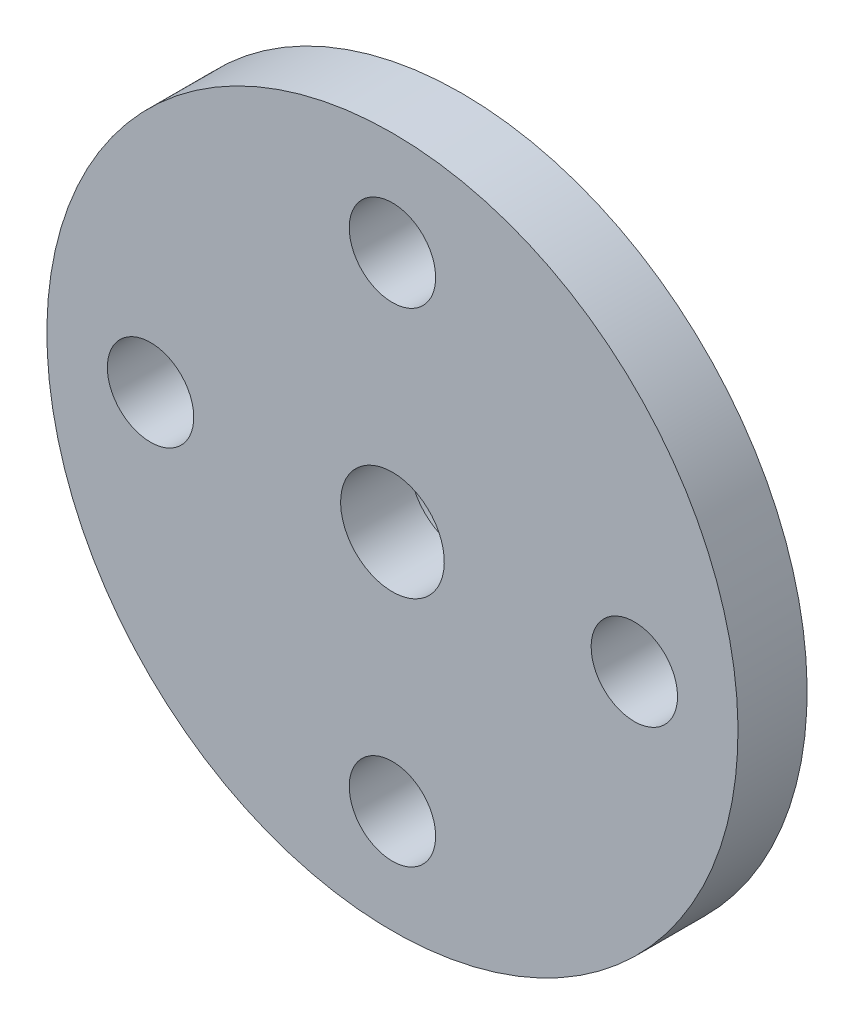
ISO-10303-21;
HEADER;
FILE_DESCRIPTION(('STEP AP214'),'2;1');
FILE_NAME('part.step','',(''),(''),'','','');
FILE_SCHEMA(('AUTOMOTIVE_DESIGN { 1 0 10303 214 1 1 1 1 }'));
ENDSEC;
DATA;
#1=APPLICATION_CONTEXT('core data for automotive mechanical design processes');
#2=APPLICATION_PROTOCOL_DEFINITION('international standard','automotive_design',2000,#1);
#3=PRODUCT_CONTEXT('',#1,'mechanical');
#4=PRODUCT('Part','Part','',(#3));
#5=PRODUCT_RELATED_PRODUCT_CATEGORY('part','',(#4));
#6=PRODUCT_DEFINITION_FORMATION('','',#4);
#7=PRODUCT_DEFINITION_CONTEXT('part definition',#1,'design');
#8=PRODUCT_DEFINITION('design','',#6,#7);
#9=PRODUCT_DEFINITION_SHAPE('','',#8);
#10=(LENGTH_UNIT() NAMED_UNIT(*) SI_UNIT(.MILLI.,.METRE.));
#11=(NAMED_UNIT(*) PLANE_ANGLE_UNIT() SI_UNIT($,.RADIAN.));
#12=(NAMED_UNIT(*) SI_UNIT($,.STERADIAN.) SOLID_ANGLE_UNIT());
#13=UNCERTAINTY_MEASURE_WITH_UNIT(LENGTH_MEASURE(1.E-05),#10,'distance_accuracy_value','');
#14=(GEOMETRIC_REPRESENTATION_CONTEXT(3) GLOBAL_UNCERTAINTY_ASSIGNED_CONTEXT((#13)) GLOBAL_UNIT_ASSIGNED_CONTEXT((#10,
#11,#12)) REPRESENTATION_CONTEXT('',''));
#15=CARTESIAN_POINT('',(0.,0.,0.));
#16=DIRECTION('',(0.,0.,1.));
#17=DIRECTION('',(1.,0.,0.));
#18=AXIS2_PLACEMENT_3D('',#15,#16,#17);
#19=CARTESIAN_POINT('',(0.,0.,0.));
#20=DIRECTION('',(0.,0.,-1.));
#21=DIRECTION('',(0.,1.,0.));
#22=AXIS2_PLACEMENT_3D('',#19,#20,#21);
#23=CYLINDRICAL_SURFACE('',#22,1.5);
#24=CARTESIAN_POINT('',(0.,0.,0.));
#25=DIRECTION('',(0.,0.,-1.));
#26=DIRECTION('',(0.,1.,0.));
#27=AXIS2_PLACEMENT_3D('',#24,#25,#26);
#28=CIRCLE('',#27,1.5);
#29=CARTESIAN_POINT('',(0.,1.5,0.));
#30=VERTEX_POINT('',#29);
#31=EDGE_CURVE('E77',#30,#30,#28,.T.);
#32=ORIENTED_EDGE('',*,*,#31,.T.);
#33=EDGE_LOOP('',(#32));
#34=FACE_BOUND('',#33,.T.);
#35=CARTESIAN_POINT('',(0.,0.,2.));
#36=DIRECTION('',(0.,0.,-1.));
#37=DIRECTION('',(0.,1.,0.));
#38=AXIS2_PLACEMENT_3D('',#35,#36,#37);
#39=CIRCLE('',#38,1.5);
#40=CARTESIAN_POINT('',(0.,1.5,2.));
#41=VERTEX_POINT('',#40);
#42=EDGE_CURVE('E10',#41,#41,#39,.T.);
#43=ORIENTED_EDGE('',*,*,#42,.F.);
#44=EDGE_LOOP('',(#43));
#45=FACE_BOUND('',#44,.T.);
#46=ADVANCED_FACE('F39',(#34,#45),#23,.F.);
#47=CARTESIAN_POINT('',(0.,1.5,2.));
#48=DIRECTION('',(0.,0.,1.));
#49=DIRECTION('',(0.,-1.,0.));
#50=AXIS2_PLACEMENT_3D('',#47,#48,#49);
#51=PLANE('',#50);
#52=CARTESIAN_POINT('',(-7.,0.,2.));
#53=DIRECTION('',(0.,0.,1.));
#54=DIRECTION('',(0.,-1.,0.));
#55=AXIS2_PLACEMENT_3D('',#52,#53,#54);
#56=CIRCLE('',#55,1.25);
#57=CARTESIAN_POINT('',(-7.,-1.24999999999993,2.));
#58=VERTEX_POINT('',#57);
#59=EDGE_CURVE('E66',#58,#58,#56,.T.);
#60=ORIENTED_EDGE('',*,*,#59,.F.);
#61=EDGE_LOOP('',(#60));
#62=FACE_BOUND('',#61,.T.);
#63=CARTESIAN_POINT('',(0.,-7.,2.));
#64=DIRECTION('',(0.,0.,1.));
#65=DIRECTION('',(0.,-1.,0.));
#66=AXIS2_PLACEMENT_3D('',#63,#64,#65);
#67=CIRCLE('',#66,1.25);
#68=CARTESIAN_POINT('',(0.,-8.25,2.));
#69=VERTEX_POINT('',#68);
#70=EDGE_CURVE('E60',#69,#69,#67,.T.);
#71=ORIENTED_EDGE('',*,*,#70,.F.);
#72=EDGE_LOOP('',(#71));
#73=FACE_BOUND('',#72,.T.);
#74=CARTESIAN_POINT('',(7.,0.,2.));
#75=DIRECTION('',(0.,0.,1.));
#76=DIRECTION('',(0.,-1.,0.));
#77=AXIS2_PLACEMENT_3D('',#74,#75,#76);
#78=CIRCLE('',#77,1.25);
#79=CARTESIAN_POINT('',(7.,-1.25000000000002,2.));
#80=VERTEX_POINT('',#79);
#81=EDGE_CURVE('E57',#80,#80,#78,.T.);
#82=ORIENTED_EDGE('',*,*,#81,.F.);
#83=EDGE_LOOP('',(#82));
#84=FACE_BOUND('',#83,.T.);
#85=CARTESIAN_POINT('',(0.,7.,2.));
#86=DIRECTION('',(0.,0.,1.));
#87=DIRECTION('',(0.,-1.,0.));
#88=AXIS2_PLACEMENT_3D('',#85,#86,#87);
#89=CIRCLE('',#88,1.25);
#90=CARTESIAN_POINT('',(0.,5.75,2.));
#91=VERTEX_POINT('',#90);
#92=EDGE_CURVE('E71',#91,#91,#89,.T.);
#93=ORIENTED_EDGE('',*,*,#92,.F.);
#94=EDGE_LOOP('',(#93));
#95=FACE_BOUND('',#94,.T.);
#96=ORIENTED_EDGE('',*,*,#42,.T.);
#97=EDGE_LOOP('',(#96));
#98=FACE_BOUND('',#97,.T.);
#99=CARTESIAN_POINT('',(0.,0.,2.));
#100=DIRECTION('',(0.,0.,-1.));
#101=DIRECTION('',(0.,1.,0.));
#102=AXIS2_PLACEMENT_3D('',#99,#100,#101);
#103=CIRCLE('',#102,10.);
#104=CARTESIAN_POINT('',(0.,10.,2.));
#105=VERTEX_POINT('',#104);
#106=EDGE_CURVE('E46',#105,#105,#103,.T.);
#107=ORIENTED_EDGE('',*,*,#106,.F.);
#108=EDGE_LOOP('',(#107));
#109=FACE_BOUND('',#108,.T.);
#110=ADVANCED_FACE('F101',(#62,#73,#84,#95,#98,#109),#51,.T.);
#111=CARTESIAN_POINT('',(0.,0.,0.));
#112=DIRECTION('',(0.,0.,-1.));
#113=DIRECTION('',(0.,1.,0.));
#114=AXIS2_PLACEMENT_3D('',#111,#112,#113);
#115=CYLINDRICAL_SURFACE('',#114,10.);
#116=ORIENTED_EDGE('',*,*,#106,.T.);
#117=EDGE_LOOP('',(#116));
#118=FACE_BOUND('',#117,.T.);
#119=CARTESIAN_POINT('',(0.,0.,0.));
#120=DIRECTION('',(0.,0.,-1.));
#121=DIRECTION('',(0.,1.,0.));
#122=AXIS2_PLACEMENT_3D('',#119,#120,#121);
#123=CIRCLE('',#122,10.);
#124=CARTESIAN_POINT('',(0.,10.,0.));
#125=VERTEX_POINT('',#124);
#126=EDGE_CURVE('E51',#125,#125,#123,.T.);
#127=ORIENTED_EDGE('',*,*,#126,.F.);
#128=EDGE_LOOP('',(#127));
#129=FACE_BOUND('',#128,.T.);
#130=ADVANCED_FACE('F97',(#118,#129),#115,.T.);
#131=CARTESIAN_POINT('',(0.,10.,0.));
#132=DIRECTION('',(0.,0.,-1.));
#133=DIRECTION('',(0.,1.,0.));
#134=AXIS2_PLACEMENT_3D('',#131,#132,#133);
#135=PLANE('',#134);
#136=CARTESIAN_POINT('',(-7.,0.,0.));
#137=DIRECTION('',(0.,0.,-1.));
#138=DIRECTION('',(0.,1.,0.));
#139=AXIS2_PLACEMENT_3D('',#136,#137,#138);
#140=CIRCLE('',#139,1.25);
#141=CARTESIAN_POINT('',(-7.,1.25000000000007,0.));
#142=VERTEX_POINT('',#141);
#143=EDGE_CURVE('E45',#142,#142,#140,.T.);
#144=ORIENTED_EDGE('',*,*,#143,.F.);
#145=EDGE_LOOP('',(#144));
#146=FACE_BOUND('',#145,.T.);
#147=CARTESIAN_POINT('',(0.,-7.,0.));
#148=DIRECTION('',(0.,0.,-1.));
#149=DIRECTION('',(0.,1.,0.));
#150=AXIS2_PLACEMENT_3D('',#147,#148,#149);
#151=CIRCLE('',#150,1.25);
#152=CARTESIAN_POINT('',(0.,-5.75,0.));
#153=VERTEX_POINT('',#152);
#154=EDGE_CURVE('E53',#153,#153,#151,.T.);
#155=ORIENTED_EDGE('',*,*,#154,.F.);
#156=EDGE_LOOP('',(#155));
#157=FACE_BOUND('',#156,.T.);
#158=CARTESIAN_POINT('',(7.,0.,0.));
#159=DIRECTION('',(0.,0.,-1.));
#160=DIRECTION('',(0.,1.,0.));
#161=AXIS2_PLACEMENT_3D('',#158,#159,#160);
#162=CIRCLE('',#161,1.25);
#163=CARTESIAN_POINT('',(7.,1.24999999999997,0.));
#164=VERTEX_POINT('',#163);
#165=EDGE_CURVE('E63',#164,#164,#162,.T.);
#166=ORIENTED_EDGE('',*,*,#165,.F.);
#167=EDGE_LOOP('',(#166));
#168=FACE_BOUND('',#167,.T.);
#169=CARTESIAN_POINT('',(0.,7.,0.));
#170=DIRECTION('',(0.,0.,-1.));
#171=DIRECTION('',(0.,1.,0.));
#172=AXIS2_PLACEMENT_3D('',#169,#170,#171);
#173=CIRCLE('',#172,1.25);
#174=CARTESIAN_POINT('',(0.,8.25,0.));
#175=VERTEX_POINT('',#174);
#176=EDGE_CURVE('E78',#175,#175,#173,.T.);
#177=ORIENTED_EDGE('',*,*,#176,.F.);
#178=EDGE_LOOP('',(#177));
#179=FACE_BOUND('',#178,.T.);
#180=ORIENTED_EDGE('',*,*,#126,.T.);
#181=EDGE_LOOP('',(#180));
#182=FACE_BOUND('',#181,.T.);
#183=CARTESIAN_POINT('',(0.,0.,0.));
#184=DIRECTION('',(0.,0.,-1.));
#185=DIRECTION('',(0.,1.,0.));
#186=AXIS2_PLACEMENT_3D('',#183,#184,#185);
#187=CIRCLE('',#186,5.);
#188=CARTESIAN_POINT('',(0.,5.,0.));
#189=VERTEX_POINT('',#188);
#190=EDGE_CURVE('E93',#189,#189,#187,.T.);
#191=ORIENTED_EDGE('',*,*,#190,.F.);
#192=EDGE_LOOP('',(#191));
#193=FACE_BOUND('',#192,.T.);
#194=ADVANCED_FACE('F96',(#146,#157,#168,#179,#182,#193),#135,.T.);
#195=CARTESIAN_POINT('',(0.,0.,0.));
#196=DIRECTION('',(0.,0.,-1.));
#197=DIRECTION('',(0.,1.,0.));
#198=AXIS2_PLACEMENT_3D('',#195,#196,#197);
#199=CYLINDRICAL_SURFACE('',#198,5.);
#200=ORIENTED_EDGE('',*,*,#190,.T.);
#201=EDGE_LOOP('',(#200));
#202=FACE_BOUND('',#201,.T.);
#203=CARTESIAN_POINT('',(0.,0.,-3.50000000000001));
#204=DIRECTION('',(0.,0.,-1.));
#205=DIRECTION('',(0.,1.,0.));
#206=AXIS2_PLACEMENT_3D('',#203,#204,#205);
#207=CIRCLE('',#206,5.);
#208=CARTESIAN_POINT('',(0.,5.,-3.50000000000001));
#209=VERTEX_POINT('',#208);
#210=EDGE_CURVE('E86',#209,#209,#207,.T.);
#211=ORIENTED_EDGE('',*,*,#210,.F.);
#212=EDGE_LOOP('',(#211));
#213=FACE_BOUND('',#212,.T.);
#214=ADVANCED_FACE('F108',(#202,#213),#199,.T.);
#215=CARTESIAN_POINT('',(0.,5.,-3.5));
#216=DIRECTION('',(0.,0.,-1.));
#217=DIRECTION('',(0.,1.,0.));
#218=AXIS2_PLACEMENT_3D('',#215,#216,#217);
#219=PLANE('',#218);
#220=ORIENTED_EDGE('',*,*,#210,.T.);
#221=EDGE_LOOP('',(#220));
#222=FACE_BOUND('',#221,.T.);
#223=CARTESIAN_POINT('',(0.,0.,-3.5));
#224=DIRECTION('',(0.,0.,-1.));
#225=DIRECTION('',(0.,1.,0.));
#226=AXIS2_PLACEMENT_3D('',#223,#224,#225);
#227=CIRCLE('',#226,3.);
#228=CARTESIAN_POINT('',(0.,3.,-3.5));
#229=VERTEX_POINT('',#228);
#230=EDGE_CURVE('E84',#229,#229,#227,.T.);
#231=ORIENTED_EDGE('',*,*,#230,.F.);
#232=EDGE_LOOP('',(#231));
#233=FACE_BOUND('',#232,.T.);
#234=ADVANCED_FACE('F132',(#222,#233),#219,.T.);
#235=CARTESIAN_POINT('',(0.,0.,0.));
#236=DIRECTION('',(0.,0.,-1.));
#237=DIRECTION('',(0.,1.,0.));
#238=AXIS2_PLACEMENT_3D('',#235,#236,#237);
#239=CYLINDRICAL_SURFACE('',#238,3.);
#240=ORIENTED_EDGE('',*,*,#230,.T.);
#241=EDGE_LOOP('',(#240));
#242=FACE_BOUND('',#241,.T.);
#243=CARTESIAN_POINT('',(0.,0.,0.));
#244=DIRECTION('',(0.,0.,-1.));
#245=DIRECTION('',(0.,1.,0.));
#246=AXIS2_PLACEMENT_3D('',#243,#244,#245);
#247=CIRCLE('',#246,3.);
#248=CARTESIAN_POINT('',(0.,3.,0.));
#249=VERTEX_POINT('',#248);
#250=EDGE_CURVE('E85',#249,#249,#247,.T.);
#251=ORIENTED_EDGE('',*,*,#250,.F.);
#252=EDGE_LOOP('',(#251));
#253=FACE_BOUND('',#252,.T.);
#254=ADVANCED_FACE('F121',(#242,#253),#239,.F.);
#255=CARTESIAN_POINT('',(0.,3.,0.));
#256=DIRECTION('',(0.,0.,-1.));
#257=DIRECTION('',(0.,1.,0.));
#258=AXIS2_PLACEMENT_3D('',#255,#256,#257);
#259=PLANE('',#258);
#260=ORIENTED_EDGE('',*,*,#250,.T.);
#261=EDGE_LOOP('',(#260));
#262=FACE_BOUND('',#261,.T.);
#263=ORIENTED_EDGE('',*,*,#31,.F.);
#264=EDGE_LOOP('',(#263));
#265=FACE_BOUND('',#264,.T.);
#266=ADVANCED_FACE('F119',(#262,#265),#259,.T.);
#267=CARTESIAN_POINT('',(0.,7.,2.));
#268=DIRECTION('',(0.,0.,1.));
#269=DIRECTION('',(0.,-1.,0.));
#270=AXIS2_PLACEMENT_3D('',#267,#268,#269);
#271=CYLINDRICAL_SURFACE('',#270,1.25);
#272=ORIENTED_EDGE('',*,*,#176,.T.);
#273=EDGE_LOOP('',(#272));
#274=FACE_BOUND('',#273,.T.);
#275=ORIENTED_EDGE('',*,*,#92,.T.);
#276=EDGE_LOOP('',(#275));
#277=FACE_BOUND('',#276,.T.);
#278=ADVANCED_FACE('F125',(#274,#277),#271,.F.);
#279=CARTESIAN_POINT('',(7.,0.,2.));
#280=DIRECTION('',(0.,0.,1.));
#281=DIRECTION('',(0.,-1.,0.));
#282=AXIS2_PLACEMENT_3D('',#279,#280,#281);
#283=CYLINDRICAL_SURFACE('',#282,1.25);
#284=ORIENTED_EDGE('',*,*,#165,.T.);
#285=EDGE_LOOP('',(#284));
#286=FACE_BOUND('',#285,.T.);
#287=ORIENTED_EDGE('',*,*,#81,.T.);
#288=EDGE_LOOP('',(#287));
#289=FACE_BOUND('',#288,.T.);
#290=ADVANCED_FACE('F133',(#286,#289),#283,.F.);
#291=CARTESIAN_POINT('',(0.,-7.,2.));
#292=DIRECTION('',(0.,0.,1.));
#293=DIRECTION('',(0.,-1.,0.));
#294=AXIS2_PLACEMENT_3D('',#291,#292,#293);
#295=CYLINDRICAL_SURFACE('',#294,1.25);
#296=ORIENTED_EDGE('',*,*,#154,.T.);
#297=EDGE_LOOP('',(#296));
#298=FACE_BOUND('',#297,.T.);
#299=ORIENTED_EDGE('',*,*,#70,.T.);
#300=EDGE_LOOP('',(#299));
#301=FACE_BOUND('',#300,.T.);
#302=ADVANCED_FACE('F184',(#298,#301),#295,.F.);
#303=CARTESIAN_POINT('',(-7.,0.,2.));
#304=DIRECTION('',(0.,0.,1.));
#305=DIRECTION('',(0.,-1.,0.));
#306=AXIS2_PLACEMENT_3D('',#303,#304,#305);
#307=CYLINDRICAL_SURFACE('',#306,1.25);
#308=ORIENTED_EDGE('',*,*,#143,.T.);
#309=EDGE_LOOP('',(#308));
#310=FACE_BOUND('',#309,.T.);
#311=ORIENTED_EDGE('',*,*,#59,.T.);
#312=EDGE_LOOP('',(#311));
#313=FACE_BOUND('',#312,.T.);
#314=ADVANCED_FACE('F192',(#310,#313),#307,.F.);
#315=CLOSED_SHELL('',(#46,#110,#130,#194,#214,#234,#254,#266,#278,#290,#302,#314));
#316=MANIFOLD_SOLID_BREP('B2',#315);
#317=ADVANCED_BREP_SHAPE_REPRESENTATION('',(#18,#316),#14);
#318=SHAPE_DEFINITION_REPRESENTATION(#9,#317);
ENDSEC;
END-ISO-10303-21;
